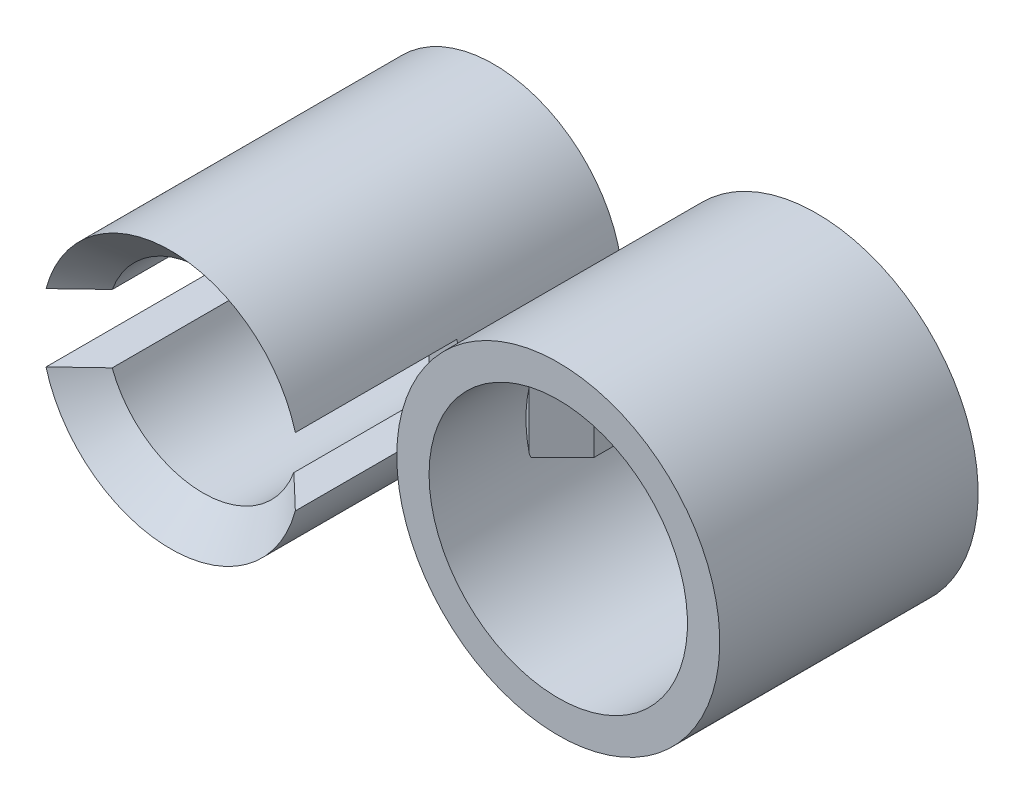
ISO-10303-21;
HEADER;
FILE_DESCRIPTION(('STEP AP214'),'2;1');
FILE_NAME('part.step','',(''),(''),'','','');
FILE_SCHEMA(('AUTOMOTIVE_DESIGN { 1 0 10303 214 1 1 1 1 }'));
ENDSEC;
DATA;
#1=APPLICATION_CONTEXT('core data for automotive mechanical design processes');
#2=APPLICATION_PROTOCOL_DEFINITION('international standard','automotive_design',2000,#1);
#3=PRODUCT_CONTEXT('',#1,'mechanical');
#4=PRODUCT('Part','Part','',(#3));
#5=PRODUCT_RELATED_PRODUCT_CATEGORY('part','',(#4));
#6=PRODUCT_DEFINITION_FORMATION('','',#4);
#7=PRODUCT_DEFINITION_CONTEXT('part definition',#1,'design');
#8=PRODUCT_DEFINITION('design','',#6,#7);
#9=PRODUCT_DEFINITION_SHAPE('','',#8);
#10=(LENGTH_UNIT() NAMED_UNIT(*) SI_UNIT(.MILLI.,.METRE.));
#11=(NAMED_UNIT(*) PLANE_ANGLE_UNIT() SI_UNIT($,.RADIAN.));
#12=(NAMED_UNIT(*) SI_UNIT($,.STERADIAN.) SOLID_ANGLE_UNIT());
#13=UNCERTAINTY_MEASURE_WITH_UNIT(LENGTH_MEASURE(1.E-05),#10,'distance_accuracy_value','');
#14=(GEOMETRIC_REPRESENTATION_CONTEXT(3) GLOBAL_UNCERTAINTY_ASSIGNED_CONTEXT((#13)) GLOBAL_UNIT_ASSIGNED_CONTEXT((#10,
#11,#12)) REPRESENTATION_CONTEXT('',''));
#15=CARTESIAN_POINT('',(0.,0.,0.));
#16=DIRECTION('',(0.,0.,1.));
#17=DIRECTION('',(1.,0.,0.));
#18=AXIS2_PLACEMENT_3D('',#15,#16,#17);
#19=CARTESIAN_POINT('',(10.,0.,8.));
#20=DIRECTION('',(0.,0.,-1.));
#21=DIRECTION('',(-1.,0.,0.));
#22=AXIS2_PLACEMENT_3D('',#19,#20,#21);
#23=CYLINDRICAL_SURFACE('',#22,4.);
#24=CARTESIAN_POINT('',(10.,0.,5.));
#25=DIRECTION('',(0.,0.,-1.));
#26=DIRECTION('',(-1.,0.,0.));
#27=AXIS2_PLACEMENT_3D('',#24,#25,#26);
#28=CIRCLE('',#27,4.);
#29=CARTESIAN_POINT('',(6.10102051443364,0.893285492512169,5.));
#30=VERTEX_POINT('',#29);
#31=CARTESIAN_POINT('',(6.10102051443364,-0.893285492512169,5.));
#32=VERTEX_POINT('',#31);
#33=EDGE_CURVE('E142',#30,#32,#28,.F.);
#34=ORIENTED_EDGE('',*,*,#33,.F.);
#35=CARTESIAN_POINT('',(10.,0.,1.10102051443363));
#36=DIRECTION('',(-0.707106781186549,0.,-0.707106781186546));
#37=DIRECTION('',(0.707106781186546,0.,-0.707106781186549));
#38=AXIS2_PLACEMENT_3D('',#35,#36,#37);
#39=ELLIPSE('',#38,5.65685424949239,4.);
#40=CARTESIAN_POINT('',(6.12701665379258,1.,4.97400386064106));
#41=VERTEX_POINT('',#40);
#42=EDGE_CURVE('E68',#30,#41,#39,.T.);
#43=ORIENTED_EDGE('',*,*,#42,.T.);
#44=DIRECTION('',(0.,0.,-1.));
#45=VECTOR('',#44,1.);
#46=CARTESIAN_POINT('',(6.12701665379258,1.,5.));
#47=LINE('',#46,#45);
#48=CARTESIAN_POINT('',(6.12701665379258,1.,0.));
#49=VERTEX_POINT('',#48);
#50=EDGE_CURVE('E163',#41,#49,#47,.T.);
#51=ORIENTED_EDGE('',*,*,#50,.T.);
#52=CARTESIAN_POINT('',(10.,0.,0.));
#53=DIRECTION('',(0.,0.,-1.));
#54=DIRECTION('',(-1.,0.,0.));
#55=AXIS2_PLACEMENT_3D('',#52,#53,#54);
#56=CIRCLE('',#55,4.);
#57=CARTESIAN_POINT('',(13.8729833462074,1.,0.));
#58=VERTEX_POINT('',#57);
#59=EDGE_CURVE('E180',#49,#58,#56,.T.);
#60=ORIENTED_EDGE('',*,*,#59,.T.);
#61=DIRECTION('',(0.,0.,-1.));
#62=VECTOR('',#61,1.);
#63=CARTESIAN_POINT('',(13.8729833462074,1.,5.));
#64=LINE('',#63,#62);
#65=CARTESIAN_POINT('',(13.8729833462074,1.,4.97400386064106));
#66=VERTEX_POINT('',#65);
#67=EDGE_CURVE('E181',#66,#58,#64,.T.);
#68=ORIENTED_EDGE('',*,*,#67,.F.);
#69=CARTESIAN_POINT('',(10.,0.,1.10102051443365));
#70=DIRECTION('',(-0.707106781186546,0.,0.707106781186549));
#71=DIRECTION('',(-0.707106781186549,0.,-0.707106781186546));
#72=AXIS2_PLACEMENT_3D('',#69,#70,#71);
#73=ELLIPSE('',#72,5.65685424949237,4.);
#74=CARTESIAN_POINT('',(13.8989794855664,0.89328549251215,5.));
#75=VERTEX_POINT('',#74);
#76=EDGE_CURVE('E213',#66,#75,#73,.F.);
#77=ORIENTED_EDGE('',*,*,#76,.T.);
#78=CARTESIAN_POINT('',(10.,0.,5.));
#79=DIRECTION('',(0.,0.,-1.));
#80=DIRECTION('',(-1.,0.,0.));
#81=AXIS2_PLACEMENT_3D('',#78,#79,#80);
#82=CIRCLE('',#81,4.);
#83=CARTESIAN_POINT('',(13.8989794855664,-0.89328549251215,5.));
#84=VERTEX_POINT('',#83);
#85=EDGE_CURVE('E166',#84,#75,#82,.F.);
#86=ORIENTED_EDGE('',*,*,#85,.F.);
#87=CARTESIAN_POINT('',(10.,0.,1.10102051443365));
#88=DIRECTION('',(-0.707106781186546,0.,0.707106781186549));
#89=DIRECTION('',(-0.707106781186549,0.,-0.707106781186546));
#90=AXIS2_PLACEMENT_3D('',#87,#88,#89);
#91=ELLIPSE('',#90,5.65685424949237,4.);
#92=CARTESIAN_POINT('',(13.8729833462074,-0.999999999999999,4.97400386064106));
#93=VERTEX_POINT('',#92);
#94=EDGE_CURVE('E215',#84,#93,#91,.F.);
#95=ORIENTED_EDGE('',*,*,#94,.T.);
#96=DIRECTION('',(0.,0.,-1.));
#97=VECTOR('',#96,1.);
#98=CARTESIAN_POINT('',(13.8729833462074,-0.999999999999999,5.));
#99=LINE('',#98,#97);
#100=CARTESIAN_POINT('',(13.8729833462074,-0.999999999999999,0.));
#101=VERTEX_POINT('',#100);
#102=EDGE_CURVE('E178',#93,#101,#99,.T.);
#103=ORIENTED_EDGE('',*,*,#102,.T.);
#104=CARTESIAN_POINT('',(6.12701665379258,-0.999999999999999,0.));
#105=VERTEX_POINT('',#104);
#106=EDGE_CURVE('E190',#101,#105,#56,.T.);
#107=ORIENTED_EDGE('',*,*,#106,.T.);
#108=DIRECTION('',(0.,0.,-1.));
#109=VECTOR('',#108,1.);
#110=CARTESIAN_POINT('',(6.12701665379258,-0.999999999999999,5.));
#111=LINE('',#110,#109);
#112=CARTESIAN_POINT('',(6.12701665379258,-0.999999999999999,4.97400386064106));
#113=VERTEX_POINT('',#112);
#114=EDGE_CURVE('E141',#113,#105,#111,.T.);
#115=ORIENTED_EDGE('',*,*,#114,.F.);
#116=CARTESIAN_POINT('',(10.,0.,1.10102051443363));
#117=DIRECTION('',(-0.707106781186549,0.,-0.707106781186546));
#118=DIRECTION('',(0.707106781186546,0.,-0.707106781186549));
#119=AXIS2_PLACEMENT_3D('',#116,#117,#118);
#120=ELLIPSE('',#119,5.65685424949239,4.);
#121=EDGE_CURVE('E13',#113,#32,#120,.T.);
#122=ORIENTED_EDGE('',*,*,#121,.T.);
#123=EDGE_LOOP('',(#34,#43,#51,#60,#68,#77,#86,#95,#103,#107,#115,#122));
#124=FACE_BOUND('',#123,.T.);
#125=CARTESIAN_POINT('',(10.,0.,8.));
#126=DIRECTION('',(0.,0.,-1.));
#127=DIRECTION('',(-1.,0.,0.));
#128=AXIS2_PLACEMENT_3D('',#125,#126,#127);
#129=CIRCLE('',#128,4.);
#130=CARTESIAN_POINT('',(6.,0.,8.));
#131=VERTEX_POINT('',#130);
#132=EDGE_CURVE('E186',#131,#131,#129,.T.);
#133=ORIENTED_EDGE('',*,*,#132,.F.);
#134=EDGE_LOOP('',(#133));
#135=FACE_BOUND('',#134,.T.);
#136=ADVANCED_FACE('F59',(#124,#135),#23,.F.);
#137=CARTESIAN_POINT('',(10.,0.,8.));
#138=DIRECTION('',(0.,0.,-1.));
#139=DIRECTION('',(-1.,0.,0.));
#140=AXIS2_PLACEMENT_3D('',#137,#138,#139);
#141=CYLINDRICAL_SURFACE('',#140,5.);
#142=CARTESIAN_POINT('',(10.,0.,8.));
#143=DIRECTION('',(0.,0.,-1.));
#144=DIRECTION('',(-1.,0.,0.));
#145=AXIS2_PLACEMENT_3D('',#142,#143,#144);
#146=CIRCLE('',#145,5.);
#147=CARTESIAN_POINT('',(5.,0.,8.));
#148=VERTEX_POINT('',#147);
#149=EDGE_CURVE('E192',#148,#148,#146,.T.);
#150=ORIENTED_EDGE('',*,*,#149,.T.);
#151=EDGE_LOOP('',(#150));
#152=FACE_BOUND('',#151,.T.);
#153=CARTESIAN_POINT('',(10.,0.,0.));
#154=DIRECTION('',(0.,0.,-1.));
#155=DIRECTION('',(-1.,0.,0.));
#156=AXIS2_PLACEMENT_3D('',#153,#154,#155);
#157=CIRCLE('',#156,5.);
#158=CARTESIAN_POINT('',(5.,0.,0.));
#159=VERTEX_POINT('',#158);
#160=EDGE_CURVE('E189',#159,#159,#157,.T.);
#161=ORIENTED_EDGE('',*,*,#160,.F.);
#162=EDGE_LOOP('',(#161));
#163=FACE_BOUND('',#162,.T.);
#164=ADVANCED_FACE('F241',(#152,#163),#141,.T.);
#165=CARTESIAN_POINT('',(10.,0.,8.));
#166=DIRECTION('',(0.,0.,-1.));
#167=DIRECTION('',(-1.,0.,0.));
#168=AXIS2_PLACEMENT_3D('',#165,#166,#167);
#169=PLANE('',#168);
#170=ORIENTED_EDGE('',*,*,#132,.T.);
#171=EDGE_LOOP('',(#170));
#172=FACE_BOUND('',#171,.T.);
#173=ORIENTED_EDGE('',*,*,#149,.F.);
#174=EDGE_LOOP('',(#173));
#175=FACE_BOUND('',#174,.T.);
#176=ADVANCED_FACE('F248',(#172,#175),#169,.F.);
#177=CARTESIAN_POINT('',(10.,0.,0.));
#178=DIRECTION('',(0.,0.,-1.));
#179=DIRECTION('',(-1.,0.,0.));
#180=AXIS2_PLACEMENT_3D('',#177,#178,#179);
#181=PLANE('',#180);
#182=ORIENTED_EDGE('',*,*,#106,.F.);
#183=DIRECTION('',(1.,0.,0.));
#184=VECTOR('',#183,1.);
#185=CARTESIAN_POINT('',(0.,-0.999999999999999,0.));
#186=LINE('',#185,#184);
#187=CARTESIAN_POINT('',(12.8989794855664,-0.999999999999999,0.));
#188=VERTEX_POINT('',#187);
#189=EDGE_CURVE('E162',#188,#101,#186,.T.);
#190=ORIENTED_EDGE('',*,*,#189,.F.);
#191=DIRECTION('',(0.,1.,0.));
#192=VECTOR('',#191,1.);
#193=CARTESIAN_POINT('',(12.8989794855664,0.,0.));
#194=LINE('',#193,#192);
#195=CARTESIAN_POINT('',(12.8989794855664,1.,0.));
#196=VERTEX_POINT('',#195);
#197=EDGE_CURVE('E173',#188,#196,#194,.T.);
#198=ORIENTED_EDGE('',*,*,#197,.T.);
#199=DIRECTION('',(1.,0.,0.));
#200=VECTOR('',#199,1.);
#201=CARTESIAN_POINT('',(0.,1.,0.));
#202=LINE('',#201,#200);
#203=EDGE_CURVE('E170',#196,#58,#202,.T.);
#204=ORIENTED_EDGE('',*,*,#203,.T.);
#205=ORIENTED_EDGE('',*,*,#59,.F.);
#206=DIRECTION('',(1.,0.,0.));
#207=VECTOR('',#206,1.);
#208=CARTESIAN_POINT('',(0.,1.,0.));
#209=LINE('',#208,#207);
#210=CARTESIAN_POINT('',(7.10102051443364,1.,0.));
#211=VERTEX_POINT('',#210);
#212=EDGE_CURVE('E150',#49,#211,#209,.T.);
#213=ORIENTED_EDGE('',*,*,#212,.T.);
#214=DIRECTION('',(0.,1.,0.));
#215=VECTOR('',#214,1.);
#216=CARTESIAN_POINT('',(7.10102051443364,0.,0.));
#217=LINE('',#216,#215);
#218=CARTESIAN_POINT('',(7.10102051443364,-0.999999999999999,0.));
#219=VERTEX_POINT('',#218);
#220=EDGE_CURVE('E139',#219,#211,#217,.T.);
#221=ORIENTED_EDGE('',*,*,#220,.F.);
#222=DIRECTION('',(1.,0.,0.));
#223=VECTOR('',#222,1.);
#224=CARTESIAN_POINT('',(0.,-0.999999999999999,0.));
#225=LINE('',#224,#223);
#226=EDGE_CURVE('E145',#105,#219,#225,.T.);
#227=ORIENTED_EDGE('',*,*,#226,.F.);
#228=EDGE_LOOP('',(#182,#190,#198,#204,#205,#213,#221,#227));
#229=FACE_BOUND('',#228,.T.);
#230=ORIENTED_EDGE('',*,*,#160,.T.);
#231=EDGE_LOOP('',(#230));
#232=FACE_BOUND('',#231,.T.);
#233=ADVANCED_FACE('F152',(#229,#232),#181,.T.);
#234=CARTESIAN_POINT('',(0.,-0.999999999999999,5.));
#235=DIRECTION('',(0.,1.,0.));
#236=DIRECTION('',(-1.,0.,0.));
#237=AXIS2_PLACEMENT_3D('',#234,#235,#236);
#238=PLANE('',#237);
#239=ORIENTED_EDGE('',*,*,#102,.F.);
#240=DIRECTION('',(-0.707106781186549,0.,-0.707106781186546));
#241=VECTOR('',#240,1.);
#242=CARTESIAN_POINT('',(12.8989794855664,-0.999999999999999,4.));
#243=LINE('',#242,#241);
#244=CARTESIAN_POINT('',(12.8989794855664,-0.999999999999999,4.));
#245=VERTEX_POINT('',#244);
#246=EDGE_CURVE('E204',#93,#245,#243,.T.);
#247=ORIENTED_EDGE('',*,*,#246,.T.);
#248=DIRECTION('',(0.,0.,-1.));
#249=VECTOR('',#248,1.);
#250=CARTESIAN_POINT('',(12.8989794855664,-0.999999999999999,5.));
#251=LINE('',#250,#249);
#252=EDGE_CURVE('E169',#245,#188,#251,.T.);
#253=ORIENTED_EDGE('',*,*,#252,.T.);
#254=ORIENTED_EDGE('',*,*,#189,.T.);
#255=EDGE_LOOP('',(#239,#247,#253,#254));
#256=FACE_BOUND('',#255,.T.);
#257=ADVANCED_FACE('F253',(#256),#238,.F.);
#258=CARTESIAN_POINT('',(0.,1.,5.));
#259=DIRECTION('',(0.,1.,0.));
#260=DIRECTION('',(-1.,0.,0.));
#261=AXIS2_PLACEMENT_3D('',#258,#259,#260);
#262=PLANE('',#261);
#263=DIRECTION('',(0.,0.,-1.));
#264=VECTOR('',#263,1.);
#265=CARTESIAN_POINT('',(12.8989794855664,1.,5.));
#266=LINE('',#265,#264);
#267=CARTESIAN_POINT('',(12.8989794855664,1.,4.));
#268=VERTEX_POINT('',#267);
#269=EDGE_CURVE('E183',#268,#196,#266,.T.);
#270=ORIENTED_EDGE('',*,*,#269,.F.);
#271=DIRECTION('',(0.707106781186549,0.,0.707106781186546));
#272=VECTOR('',#271,1.);
#273=CARTESIAN_POINT('',(6.94948974278316,1.,-1.94948974278318));
#274=LINE('',#273,#272);
#275=EDGE_CURVE('E200',#268,#66,#274,.T.);
#276=ORIENTED_EDGE('',*,*,#275,.T.);
#277=ORIENTED_EDGE('',*,*,#67,.T.);
#278=ORIENTED_EDGE('',*,*,#203,.F.);
#279=EDGE_LOOP('',(#270,#276,#277,#278));
#280=FACE_BOUND('',#279,.T.);
#281=ADVANCED_FACE('F265',(#280),#262,.T.);
#282=CARTESIAN_POINT('',(12.8989794855664,0.,5.));
#283=DIRECTION('',(-1.,0.,0.));
#284=DIRECTION('',(0.,0.,1.));
#285=AXIS2_PLACEMENT_3D('',#282,#283,#284);
#286=PLANE('',#285);
#287=ORIENTED_EDGE('',*,*,#252,.F.);
#288=DIRECTION('',(0.,1.,0.));
#289=VECTOR('',#288,1.);
#290=CARTESIAN_POINT('',(12.8989794855664,1.,4.));
#291=LINE('',#290,#289);
#292=EDGE_CURVE('E195',#245,#268,#291,.T.);
#293=ORIENTED_EDGE('',*,*,#292,.T.);
#294=ORIENTED_EDGE('',*,*,#269,.T.);
#295=ORIENTED_EDGE('',*,*,#197,.F.);
#296=EDGE_LOOP('',(#287,#293,#294,#295));
#297=FACE_BOUND('',#296,.T.);
#298=ADVANCED_FACE('F270',(#297),#286,.T.);
#299=CARTESIAN_POINT('',(0.,0.,5.));
#300=DIRECTION('',(0.,0.,-1.));
#301=DIRECTION('',(-1.,0.,0.));
#302=AXIS2_PLACEMENT_3D('',#299,#300,#301);
#303=PLANE('',#302);
#304=ORIENTED_EDGE('',*,*,#85,.T.);
#305=DIRECTION('',(0.,-1.,0.));
#306=VECTOR('',#305,1.);
#307=CARTESIAN_POINT('',(13.8989794855664,-0.999999999999999,5.));
#308=LINE('',#307,#306);
#309=EDGE_CURVE('E202',#75,#84,#308,.T.);
#310=ORIENTED_EDGE('',*,*,#309,.T.);
#311=EDGE_LOOP('',(#304,#310));
#312=FACE_BOUND('',#311,.T.);
#313=ADVANCED_FACE('F288',(#312),#303,.F.);
#314=CARTESIAN_POINT('',(7.10102051443364,0.,5.));
#315=DIRECTION('',(-1.,0.,0.));
#316=DIRECTION('',(0.,0.,1.));
#317=AXIS2_PLACEMENT_3D('',#314,#315,#316);
#318=PLANE('',#317);
#319=DIRECTION('',(0.,0.,-1.));
#320=VECTOR('',#319,1.);
#321=CARTESIAN_POINT('',(7.10102051443364,1.,5.));
#322=LINE('',#321,#320);
#323=CARTESIAN_POINT('',(7.10102051443364,1.,4.));
#324=VERTEX_POINT('',#323);
#325=EDGE_CURVE('E160',#324,#211,#322,.T.);
#326=ORIENTED_EDGE('',*,*,#325,.F.);
#327=DIRECTION('',(0.,-1.,0.));
#328=VECTOR('',#327,1.);
#329=CARTESIAN_POINT('',(7.10102051443364,0.,4.));
#330=LINE('',#329,#328);
#331=CARTESIAN_POINT('',(7.10102051443364,-0.999999999999999,4.));
#332=VERTEX_POINT('',#331);
#333=EDGE_CURVE('E83',#324,#332,#330,.T.);
#334=ORIENTED_EDGE('',*,*,#333,.T.);
#335=DIRECTION('',(0.,0.,-1.));
#336=VECTOR('',#335,1.);
#337=CARTESIAN_POINT('',(7.10102051443364,-0.999999999999999,5.));
#338=LINE('',#337,#336);
#339=EDGE_CURVE('E135',#332,#219,#338,.T.);
#340=ORIENTED_EDGE('',*,*,#339,.T.);
#341=ORIENTED_EDGE('',*,*,#220,.T.);
#342=EDGE_LOOP('',(#326,#334,#340,#341));
#343=FACE_BOUND('',#342,.T.);
#344=ADVANCED_FACE('F137',(#343),#318,.F.);
#345=CARTESIAN_POINT('',(0.,1.,5.));
#346=DIRECTION('',(0.,1.,0.));
#347=DIRECTION('',(-1.,0.,0.));
#348=AXIS2_PLACEMENT_3D('',#345,#346,#347);
#349=PLANE('',#348);
#350=ORIENTED_EDGE('',*,*,#50,.F.);
#351=DIRECTION('',(-0.707106781186546,0.,0.707106781186549));
#352=VECTOR('',#351,1.);
#353=CARTESIAN_POINT('',(3.05051025721683,1.,8.05051025721682));
#354=LINE('',#353,#352);
#355=EDGE_CURVE('E209',#41,#324,#354,.F.);
#356=ORIENTED_EDGE('',*,*,#355,.T.);
#357=ORIENTED_EDGE('',*,*,#325,.T.);
#358=ORIENTED_EDGE('',*,*,#212,.F.);
#359=EDGE_LOOP('',(#350,#356,#357,#358));
#360=FACE_BOUND('',#359,.T.);
#361=ADVANCED_FACE('F226',(#360),#349,.T.);
#362=CARTESIAN_POINT('',(0.,-0.999999999999999,5.));
#363=DIRECTION('',(0.,1.,0.));
#364=DIRECTION('',(-1.,0.,0.));
#365=AXIS2_PLACEMENT_3D('',#362,#363,#364);
#366=PLANE('',#365);
#367=ORIENTED_EDGE('',*,*,#339,.F.);
#368=DIRECTION('',(0.707106781186546,0.,-0.707106781186549));
#369=VECTOR('',#368,1.);
#370=CARTESIAN_POINT('',(6.10102051443364,-0.999999999999999,5.));
#371=LINE('',#370,#369);
#372=EDGE_CURVE('E75',#332,#113,#371,.F.);
#373=ORIENTED_EDGE('',*,*,#372,.T.);
#374=ORIENTED_EDGE('',*,*,#114,.T.);
#375=ORIENTED_EDGE('',*,*,#226,.T.);
#376=EDGE_LOOP('',(#367,#373,#374,#375));
#377=FACE_BOUND('',#376,.T.);
#378=ADVANCED_FACE('F146',(#377),#366,.F.);
#379=CARTESIAN_POINT('',(0.,0.,5.));
#380=DIRECTION('',(0.,0.,-1.));
#381=DIRECTION('',(-1.,0.,0.));
#382=AXIS2_PLACEMENT_3D('',#379,#380,#381);
#383=PLANE('',#382);
#384=ORIENTED_EDGE('',*,*,#33,.T.);
#385=DIRECTION('',(0.,1.,0.));
#386=VECTOR('',#385,1.);
#387=CARTESIAN_POINT('',(6.10102051443364,0.,5.));
#388=LINE('',#387,#386);
#389=EDGE_CURVE('E206',#32,#30,#388,.T.);
#390=ORIENTED_EDGE('',*,*,#389,.T.);
#391=EDGE_LOOP('',(#384,#390));
#392=FACE_BOUND('',#391,.T.);
#393=ADVANCED_FACE('F229',(#392),#383,.F.);
#394=CARTESIAN_POINT('',(12.8989794855664,0.,4.));
#395=DIRECTION('',(-0.707106781186546,0.,0.707106781186549));
#396=DIRECTION('',(0.,-1.,0.));
#397=AXIS2_PLACEMENT_3D('',#394,#395,#396);
#398=PLANE('',#397);
#399=ORIENTED_EDGE('',*,*,#94,.F.);
#400=ORIENTED_EDGE('',*,*,#309,.F.);
#401=ORIENTED_EDGE('',*,*,#76,.F.);
#402=ORIENTED_EDGE('',*,*,#275,.F.);
#403=ORIENTED_EDGE('',*,*,#292,.F.);
#404=ORIENTED_EDGE('',*,*,#246,.F.);
#405=EDGE_LOOP('',(#399,#400,#401,#402,#403,#404));
#406=FACE_BOUND('',#405,.T.);
#407=ADVANCED_FACE('F231',(#406),#398,.T.);
#408=CARTESIAN_POINT('',(6.10102051443364,0.,5.));
#409=DIRECTION('',(-0.707106781186549,0.,-0.707106781186546));
#410=DIRECTION('',(0.,1.,0.));
#411=AXIS2_PLACEMENT_3D('',#408,#409,#410);
#412=PLANE('',#411);
#413=ORIENTED_EDGE('',*,*,#372,.F.);
#414=ORIENTED_EDGE('',*,*,#333,.F.);
#415=ORIENTED_EDGE('',*,*,#355,.F.);
#416=ORIENTED_EDGE('',*,*,#42,.F.);
#417=ORIENTED_EDGE('',*,*,#389,.F.);
#418=ORIENTED_EDGE('',*,*,#121,.F.);
#419=EDGE_LOOP('',(#413,#414,#415,#416,#417,#418));
#420=FACE_BOUND('',#419,.T.);
#421=ADVANCED_FACE('F62',(#420),#412,.F.);
#422=CLOSED_SHELL('',(#136,#164,#176,#233,#257,#281,#298,#313,#344,#361,#378,#393,#407,#421));
#423=MANIFOLD_SOLID_BREP('B2',#422);
#424=CARTESIAN_POINT('',(0.,0.,0.));
#425=DIRECTION('',(0.,0.,1.));
#426=DIRECTION('',(1.,0.,0.));
#427=AXIS2_PLACEMENT_3D('',#424,#425,#426);
#428=PLANE('',#427);
#429=CARTESIAN_POINT('',(0.,0.,0.));
#430=DIRECTION('',(0.,0.,1.));
#431=DIRECTION('',(1.,0.,0.));
#432=AXIS2_PLACEMENT_3D('',#429,#430,#431);
#433=CIRCLE('',#432,4.);
#434=CARTESIAN_POINT('',(4.,0.,0.));
#435=VERTEX_POINT('',#434);
#436=EDGE_CURVE('E559',#435,#435,#433,.T.);
#437=ORIENTED_EDGE('',*,*,#436,.F.);
#438=EDGE_LOOP('',(#437));
#439=FACE_BOUND('',#438,.T.);
#440=CARTESIAN_POINT('',(0.,0.,0.));
#441=DIRECTION('',(0.,0.,1.));
#442=DIRECTION('',(1.,0.,0.));
#443=AXIS2_PLACEMENT_3D('',#440,#441,#442);
#444=CIRCLE('',#443,3.);
#445=CARTESIAN_POINT('',(3.,0.,0.));
#446=VERTEX_POINT('',#445);
#447=EDGE_CURVE('E554',#446,#446,#444,.T.);
#448=ORIENTED_EDGE('',*,*,#447,.T.);
#449=EDGE_LOOP('',(#448));
#450=FACE_BOUND('',#449,.T.);
#451=ADVANCED_FACE('F385',(#439,#450),#428,.F.);
#452=CARTESIAN_POINT('',(0.,0.,10.));
#453=DIRECTION('',(0.,0.,-1.));
#454=DIRECTION('',(-1.,0.,0.));
#455=AXIS2_PLACEMENT_3D('',#452,#453,#454);
#456=CYLINDRICAL_SURFACE('',#455,4.);
#457=CARTESIAN_POINT('',(0.,0.,5.));
#458=DIRECTION('',(0.,0.,-1.));
#459=DIRECTION('',(-1.,0.,0.));
#460=AXIS2_PLACEMENT_3D('',#457,#458,#459);
#461=CIRCLE('',#460,4.);
#462=CARTESIAN_POINT('',(3.85972796968906,1.05,5.));
#463=VERTEX_POINT('',#462);
#464=CARTESIAN_POINT('',(3.85972796968906,-1.05,5.));
#465=VERTEX_POINT('',#464);
#466=EDGE_CURVE('E551',#463,#465,#461,.T.);
#467=ORIENTED_EDGE('',*,*,#466,.T.);
#468=DIRECTION('',(0.,0.,-1.));
#469=VECTOR('',#468,1.);
#470=CARTESIAN_POINT('',(3.85972796968906,-1.05,10.));
#471=LINE('',#470,#469);
#472=CARTESIAN_POINT('',(3.85972796968906,-1.05,10.));
#473=VERTEX_POINT('',#472);
#474=EDGE_CURVE('E464',#465,#473,#471,.F.);
#475=ORIENTED_EDGE('',*,*,#474,.T.);
#476=CARTESIAN_POINT('',(0.,0.,10.));
#477=DIRECTION('',(0.,0.,1.));
#478=DIRECTION('',(1.,0.,0.));
#479=AXIS2_PLACEMENT_3D('',#476,#477,#478);
#480=CIRCLE('',#479,4.);
#481=CARTESIAN_POINT('',(-3.85972796968906,-1.05,10.));
#482=VERTEX_POINT('',#481);
#483=EDGE_CURVE('E473',#482,#473,#480,.T.);
#484=ORIENTED_EDGE('',*,*,#483,.F.);
#485=DIRECTION('',(0.,0.,-1.));
#486=VECTOR('',#485,1.);
#487=CARTESIAN_POINT('',(-3.85972796968906,-1.05,10.));
#488=LINE('',#487,#486);
#489=CARTESIAN_POINT('',(-3.85972796968906,-1.05,5.));
#490=VERTEX_POINT('',#489);
#491=EDGE_CURVE('E552',#482,#490,#488,.T.);
#492=ORIENTED_EDGE('',*,*,#491,.T.);
#493=CARTESIAN_POINT('',(-3.85972796968906,1.05,5.));
#494=VERTEX_POINT('',#493);
#495=EDGE_CURVE('E643',#490,#494,#461,.T.);
#496=ORIENTED_EDGE('',*,*,#495,.T.);
#497=DIRECTION('',(0.,0.,-1.));
#498=VECTOR('',#497,1.);
#499=CARTESIAN_POINT('',(-3.85972796968906,1.05,10.));
#500=LINE('',#499,#498);
#501=CARTESIAN_POINT('',(-3.85972796968906,1.05,10.));
#502=VERTEX_POINT('',#501);
#503=EDGE_CURVE('E465',#494,#502,#500,.F.);
#504=ORIENTED_EDGE('',*,*,#503,.T.);
#505=CARTESIAN_POINT('',(3.85972796968906,1.05,10.));
#506=VERTEX_POINT('',#505);
#507=EDGE_CURVE('E468',#506,#502,#480,.T.);
#508=ORIENTED_EDGE('',*,*,#507,.F.);
#509=DIRECTION('',(0.,0.,-1.));
#510=VECTOR('',#509,1.);
#511=CARTESIAN_POINT('',(3.85972796968906,1.05,10.));
#512=LINE('',#511,#510);
#513=EDGE_CURVE('E456',#506,#463,#512,.T.);
#514=ORIENTED_EDGE('',*,*,#513,.T.);
#515=EDGE_LOOP('',(#467,#475,#484,#492,#496,#504,#508,#514));
#516=FACE_BOUND('',#515,.T.);
#517=ORIENTED_EDGE('',*,*,#436,.T.);
#518=EDGE_LOOP('',(#517));
#519=FACE_BOUND('',#518,.T.);
#520=ADVANCED_FACE('F469',(#516,#519),#456,.T.);
#521=CARTESIAN_POINT('',(0.,0.,10.));
#522=DIRECTION('',(0.,0.,-1.));
#523=DIRECTION('',(-1.,0.,0.));
#524=AXIS2_PLACEMENT_3D('',#521,#522,#523);
#525=CYLINDRICAL_SURFACE('',#524,3.);
#526=DIRECTION('',(0.,0.,-1.));
#527=VECTOR('',#526,1.);
#528=CARTESIAN_POINT('',(-2.81024909927928,-1.05,10.));
#529=LINE('',#528,#527);
#530=CARTESIAN_POINT('',(-2.81024909927928,-1.05,9.));
#531=VERTEX_POINT('',#530);
#532=CARTESIAN_POINT('',(-2.81024909927928,-1.05,5.));
#533=VERTEX_POINT('',#532);
#534=EDGE_CURVE('E528',#531,#533,#529,.T.);
#535=ORIENTED_EDGE('',*,*,#534,.F.);
#536=CARTESIAN_POINT('',(0.,0.,9.));
#537=DIRECTION('',(0.,0.,1.));
#538=DIRECTION('',(1.,0.,0.));
#539=AXIS2_PLACEMENT_3D('',#536,#537,#538);
#540=CIRCLE('',#539,3.);
#541=CARTESIAN_POINT('',(2.81024909927928,-1.05,9.));
#542=VERTEX_POINT('',#541);
#543=EDGE_CURVE('E479',#531,#542,#540,.T.);
#544=ORIENTED_EDGE('',*,*,#543,.T.);
#545=DIRECTION('',(0.,0.,-1.));
#546=VECTOR('',#545,1.);
#547=CARTESIAN_POINT('',(2.81024909927928,-1.05,10.));
#548=LINE('',#547,#546);
#549=CARTESIAN_POINT('',(2.81024909927928,-1.05,5.));
#550=VERTEX_POINT('',#549);
#551=EDGE_CURVE('E480',#550,#542,#548,.F.);
#552=ORIENTED_EDGE('',*,*,#551,.F.);
#553=CARTESIAN_POINT('',(0.,0.,5.));
#554=DIRECTION('',(0.,0.,-1.));
#555=DIRECTION('',(-1.,0.,0.));
#556=AXIS2_PLACEMENT_3D('',#553,#554,#555);
#557=CIRCLE('',#556,3.);
#558=CARTESIAN_POINT('',(2.81024909927928,1.05,5.));
#559=VERTEX_POINT('',#558);
#560=EDGE_CURVE('E530',#559,#550,#557,.T.);
#561=ORIENTED_EDGE('',*,*,#560,.F.);
#562=DIRECTION('',(0.,0.,-1.));
#563=VECTOR('',#562,1.);
#564=CARTESIAN_POINT('',(2.81024909927928,1.05,10.));
#565=LINE('',#564,#563);
#566=CARTESIAN_POINT('',(2.81024909927928,1.05,9.));
#567=VERTEX_POINT('',#566);
#568=EDGE_CURVE('E486',#567,#559,#565,.T.);
#569=ORIENTED_EDGE('',*,*,#568,.F.);
#570=CARTESIAN_POINT('',(0.,0.,9.));
#571=DIRECTION('',(0.,0.,1.));
#572=DIRECTION('',(1.,0.,0.));
#573=AXIS2_PLACEMENT_3D('',#570,#571,#572);
#574=CIRCLE('',#573,3.);
#575=CARTESIAN_POINT('',(-2.81024909927928,1.05,9.));
#576=VERTEX_POINT('',#575);
#577=EDGE_CURVE('E475',#567,#576,#574,.T.);
#578=ORIENTED_EDGE('',*,*,#577,.T.);
#579=DIRECTION('',(0.,0.,-1.));
#580=VECTOR('',#579,1.);
#581=CARTESIAN_POINT('',(-2.81024909927928,1.05,10.));
#582=LINE('',#581,#580);
#583=CARTESIAN_POINT('',(-2.81024909927928,1.05,5.));
#584=VERTEX_POINT('',#583);
#585=EDGE_CURVE('E525',#584,#576,#582,.F.);
#586=ORIENTED_EDGE('',*,*,#585,.F.);
#587=EDGE_CURVE('E472',#533,#584,#557,.T.);
#588=ORIENTED_EDGE('',*,*,#587,.F.);
#589=EDGE_LOOP('',(#535,#544,#552,#561,#569,#578,#586,#588));
#590=FACE_BOUND('',#589,.T.);
#591=ORIENTED_EDGE('',*,*,#447,.F.);
#592=EDGE_LOOP('',(#591));
#593=FACE_BOUND('',#592,.T.);
#594=ADVANCED_FACE('F515',(#590,#593),#525,.F.);
#595=CARTESIAN_POINT('',(0.,0.,5.));
#596=DIRECTION('',(0.,0.,-1.));
#597=DIRECTION('',(-1.,0.,0.));
#598=AXIS2_PLACEMENT_3D('',#595,#596,#597);
#599=PLANE('',#598);
#600=ORIENTED_EDGE('',*,*,#495,.F.);
#601=DIRECTION('',(1.,0.,0.));
#602=VECTOR('',#601,1.);
#603=CARTESIAN_POINT('',(-4.,-1.05,5.));
#604=LINE('',#603,#602);
#605=EDGE_CURVE('E543',#490,#533,#604,.T.);
#606=ORIENTED_EDGE('',*,*,#605,.T.);
#607=ORIENTED_EDGE('',*,*,#587,.T.);
#608=DIRECTION('',(-1.,0.,0.));
#609=VECTOR('',#608,1.);
#610=CARTESIAN_POINT('',(-4.,1.05,5.));
#611=LINE('',#610,#609);
#612=EDGE_CURVE('E526',#584,#494,#611,.T.);
#613=ORIENTED_EDGE('',*,*,#612,.T.);
#614=EDGE_LOOP('',(#600,#606,#607,#613));
#615=FACE_BOUND('',#614,.T.);
#616=ADVANCED_FACE('F567',(#615),#599,.F.);
#617=CARTESIAN_POINT('',(-4.,1.05,5.));
#618=DIRECTION('',(0.,1.,0.));
#619=DIRECTION('',(0.,0.,1.));
#620=AXIS2_PLACEMENT_3D('',#617,#618,#619);
#621=PLANE('',#620);
#622=ORIENTED_EDGE('',*,*,#585,.T.);
#623=CARTESIAN_POINT('',(-2.81024909927928,1.05,9.));
#624=CARTESIAN_POINT('',(-2.8984083089305,1.05,9.08259340705093));
#625=CARTESIAN_POINT('',(-2.98634008811335,1.05,9.16542866583623));
#626=CARTESIAN_POINT('',(-3.16182925623992,1.05,9.33149262676662));
#627=CARTESIAN_POINT('',(-3.24938665012661,1.05,9.41472132368645));
#628=CARTESIAN_POINT('',(-3.42420939422282,1.05,9.5814836592396));
#629=CARTESIAN_POINT('',(-3.51147474594998,1.05,9.66501729628351));
#630=CARTESIAN_POINT('',(-3.68576724426013,1.05,9.83233505391422));
#631=CARTESIAN_POINT('',(-3.77279438769273,1.05,9.91611917778342));
#632=CARTESIAN_POINT('',(-3.85972796968906,1.05,10.));
#633=B_SPLINE_CURVE_WITH_KNOTS('',3,(#623,#624,#625,#626,#627,#628,#629,#630,#631,#632),
.UNSPECIFIED.,.F.,.F.,(4,2,2,2,4),(0.,0.362412033620698,0.724819267494261,1.08722461513588,
1.44963473278008),.UNSPECIFIED.);
#634=EDGE_CURVE('E400',#576,#502,#633,.T.);
#635=ORIENTED_EDGE('',*,*,#634,.T.);
#636=ORIENTED_EDGE('',*,*,#503,.F.);
#637=ORIENTED_EDGE('',*,*,#612,.F.);
#638=EDGE_LOOP('',(#622,#635,#636,#637));
#639=FACE_BOUND('',#638,.T.);
#640=ADVANCED_FACE('F509',(#639),#621,.F.);
#641=CARTESIAN_POINT('',(-4.,-1.05,5.));
#642=DIRECTION('',(0.,-1.,0.));
#643=DIRECTION('',(0.,0.,-1.));
#644=AXIS2_PLACEMENT_3D('',#641,#642,#643);
#645=PLANE('',#644);
#646=ORIENTED_EDGE('',*,*,#491,.F.);
#647=CARTESIAN_POINT('',(-3.85972796968906,-1.05,10.));
#648=CARTESIAN_POINT('',(-3.77279438769273,-1.05,9.91611917778342));
#649=CARTESIAN_POINT('',(-3.68576724426013,-1.05,9.83233505391422));
#650=CARTESIAN_POINT('',(-3.51147474594998,-1.05,9.66501729628351));
#651=CARTESIAN_POINT('',(-3.42420939422282,-1.05,9.5814836592396));
#652=CARTESIAN_POINT('',(-3.24938665012661,-1.05,9.41472132368645));
#653=CARTESIAN_POINT('',(-3.16182925623992,-1.05,9.33149262676662));
#654=CARTESIAN_POINT('',(-2.98634008811335,-1.05,9.16542866583623));
#655=CARTESIAN_POINT('',(-2.8984083089305,-1.05,9.08259340705093));
#656=CARTESIAN_POINT('',(-2.81024909927928,-1.05,9.));
#657=B_SPLINE_CURVE_WITH_KNOTS('',3,(#647,#648,#649,#650,#651,#652,#653,#654,#655,#656),
.UNSPECIFIED.,.F.,.F.,(4,2,2,2,4),(0.,0.362410117644203,0.724815465285819,1.08722269915938,
1.44963473278008),.UNSPECIFIED.);
#658=EDGE_CURVE('E407',#482,#531,#657,.T.);
#659=ORIENTED_EDGE('',*,*,#658,.T.);
#660=ORIENTED_EDGE('',*,*,#534,.T.);
#661=ORIENTED_EDGE('',*,*,#605,.F.);
#662=EDGE_LOOP('',(#646,#659,#660,#661));
#663=FACE_BOUND('',#662,.T.);
#664=ADVANCED_FACE('F504',(#663),#645,.F.);
#665=ORIENTED_EDGE('',*,*,#551,.T.);
#666=CARTESIAN_POINT('',(2.81024909927928,-1.05,9.));
#667=CARTESIAN_POINT('',(2.8984083089305,-1.05,9.08259340705093));
#668=CARTESIAN_POINT('',(2.98634008811335,-1.05,9.16542866583623));
#669=CARTESIAN_POINT('',(3.16182925623992,-1.05,9.33149262676662));
#670=CARTESIAN_POINT('',(3.24938665012661,-1.05,9.41472132368645));
#671=CARTESIAN_POINT('',(3.42420939422282,-1.05,9.5814836592396));
#672=CARTESIAN_POINT('',(3.51147474594998,-1.05,9.66501729628351));
#673=CARTESIAN_POINT('',(3.68576724426013,-1.05,9.83233505391422));
#674=CARTESIAN_POINT('',(3.77279438769273,-1.05,9.91611917778342));
#675=CARTESIAN_POINT('',(3.85972796968906,-1.05,10.));
#676=B_SPLINE_CURVE_WITH_KNOTS('',3,(#666,#667,#668,#669,#670,#671,#672,#673,#674,#675),
.UNSPECIFIED.,.F.,.F.,(4,2,2,2,4),(0.,0.362412033620698,0.724819267494261,1.08722461513588,
1.44963473278008),.UNSPECIFIED.);
#677=EDGE_CURVE('E483',#542,#473,#676,.T.);
#678=ORIENTED_EDGE('',*,*,#677,.T.);
#679=ORIENTED_EDGE('',*,*,#474,.F.);
#680=EDGE_CURVE('E538',#550,#465,#604,.T.);
#681=ORIENTED_EDGE('',*,*,#680,.F.);
#682=EDGE_LOOP('',(#665,#678,#679,#681));
#683=FACE_BOUND('',#682,.T.);
#684=ADVANCED_FACE('F508',(#683),#645,.F.);
#685=ORIENTED_EDGE('',*,*,#513,.F.);
#686=CARTESIAN_POINT('',(3.85972796968906,1.05,10.));
#687=CARTESIAN_POINT('',(3.77279438769273,1.05,9.91611917778342));
#688=CARTESIAN_POINT('',(3.68576724426013,1.05,9.83233505391422));
#689=CARTESIAN_POINT('',(3.51147474594998,1.05,9.66501729628351));
#690=CARTESIAN_POINT('',(3.42420939422282,1.05,9.5814836592396));
#691=CARTESIAN_POINT('',(3.24938665012661,1.05,9.41472132368645));
#692=CARTESIAN_POINT('',(3.16182925623992,1.05,9.33149262676662));
#693=CARTESIAN_POINT('',(2.98634008811335,1.05,9.16542866583623));
#694=CARTESIAN_POINT('',(2.8984083089305,1.05,9.08259340705093));
#695=CARTESIAN_POINT('',(2.81024909927928,1.05,9.));
#696=B_SPLINE_CURVE_WITH_KNOTS('',3,(#686,#687,#688,#689,#690,#691,#692,#693,#694,#695),
.UNSPECIFIED.,.F.,.F.,(4,2,2,2,4),(0.,0.362410117644203,0.724815465285819,1.08722269915938,
1.44963473278008),.UNSPECIFIED.);
#697=EDGE_CURVE('E57',#506,#567,#696,.T.);
#698=ORIENTED_EDGE('',*,*,#697,.T.);
#699=ORIENTED_EDGE('',*,*,#568,.T.);
#700=EDGE_CURVE('E462',#463,#559,#611,.T.);
#701=ORIENTED_EDGE('',*,*,#700,.F.);
#702=EDGE_LOOP('',(#685,#698,#699,#701));
#703=FACE_BOUND('',#702,.T.);
#704=ADVANCED_FACE('F458',(#703),#621,.F.);
#705=ORIENTED_EDGE('',*,*,#700,.T.);
#706=ORIENTED_EDGE('',*,*,#560,.T.);
#707=ORIENTED_EDGE('',*,*,#680,.T.);
#708=ORIENTED_EDGE('',*,*,#466,.F.);
#709=EDGE_LOOP('',(#705,#706,#707,#708));
#710=FACE_BOUND('',#709,.T.);
#711=ADVANCED_FACE('F510',(#710),#599,.F.);
#712=CARTESIAN_POINT('',(0.,0.,9.));
#713=DIRECTION('',(0.,0.,1.));
#714=DIRECTION('',(1.,0.,0.));
#715=AXIS2_PLACEMENT_3D('',#712,#713,#714);
#716=CONICAL_SURFACE('',#715,3.,0.78539816339745);
#717=ORIENTED_EDGE('',*,*,#658,.F.);
#718=ORIENTED_EDGE('',*,*,#483,.T.);
#719=ORIENTED_EDGE('',*,*,#677,.F.);
#720=ORIENTED_EDGE('',*,*,#543,.F.);
#721=EDGE_LOOP('',(#717,#718,#719,#720));
#722=FACE_BOUND('',#721,.T.);
#723=ADVANCED_FACE('F501',(#722),#716,.F.);
#724=CARTESIAN_POINT('',(0.,0.,9.));
#725=DIRECTION('',(0.,0.,1.));
#726=DIRECTION('',(1.,0.,0.));
#727=AXIS2_PLACEMENT_3D('',#724,#725,#726);
#728=CONICAL_SURFACE('',#727,3.,0.78539816339745);
#729=ORIENTED_EDGE('',*,*,#697,.F.);
#730=ORIENTED_EDGE('',*,*,#507,.T.);
#731=ORIENTED_EDGE('',*,*,#634,.F.);
#732=ORIENTED_EDGE('',*,*,#577,.F.);
#733=EDGE_LOOP('',(#729,#730,#731,#732));
#734=FACE_BOUND('',#733,.T.);
#735=ADVANCED_FACE('F388',(#734),#728,.F.);
#736=CLOSED_SHELL('',(#451,#520,#594,#616,#640,#664,#684,#704,#711,#723,#735));
#737=MANIFOLD_SOLID_BREP('B7',#736);
#738=ADVANCED_BREP_SHAPE_REPRESENTATION('',(#18,#423,#737),#14);
#739=SHAPE_DEFINITION_REPRESENTATION(#9,#738);
ENDSEC;
END-ISO-10303-21;
